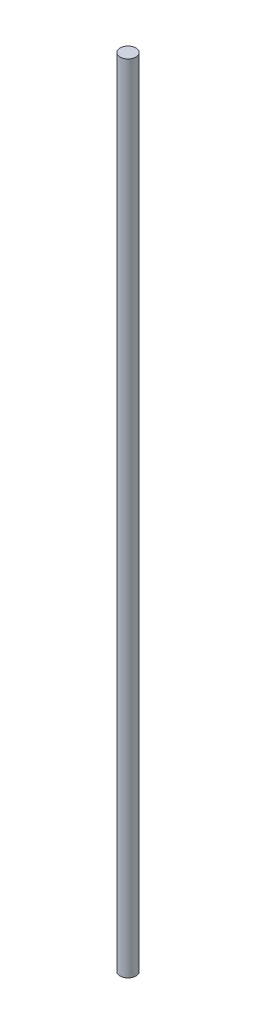
ISO-10303-21;
HEADER;
FILE_DESCRIPTION(('STEP AP214'),'2;1');
FILE_NAME('part.step','',(''),(''),'','','');
FILE_SCHEMA(('AUTOMOTIVE_DESIGN { 1 0 10303 214 1 1 1 1 }'));
ENDSEC;
DATA;
#1=APPLICATION_CONTEXT('core data for automotive mechanical design processes');
#2=APPLICATION_PROTOCOL_DEFINITION('international standard','automotive_design',2000,#1);
#3=PRODUCT_CONTEXT('',#1,'mechanical');
#4=PRODUCT('Part','Part','',(#3));
#5=PRODUCT_RELATED_PRODUCT_CATEGORY('part','',(#4));
#6=PRODUCT_DEFINITION_FORMATION('','',#4);
#7=PRODUCT_DEFINITION_CONTEXT('part definition',#1,'design');
#8=PRODUCT_DEFINITION('design','',#6,#7);
#9=PRODUCT_DEFINITION_SHAPE('','',#8);
#10=(LENGTH_UNIT() NAMED_UNIT(*) SI_UNIT(.MILLI.,.METRE.));
#11=(NAMED_UNIT(*) PLANE_ANGLE_UNIT() SI_UNIT($,.RADIAN.));
#12=(NAMED_UNIT(*) SI_UNIT($,.STERADIAN.) SOLID_ANGLE_UNIT());
#13=UNCERTAINTY_MEASURE_WITH_UNIT(LENGTH_MEASURE(1.E-05),#10,'distance_accuracy_value','');
#14=(GEOMETRIC_REPRESENTATION_CONTEXT(3) GLOBAL_UNCERTAINTY_ASSIGNED_CONTEXT((#13)) GLOBAL_UNIT_ASSIGNED_CONTEXT((#10,
#11,#12)) REPRESENTATION_CONTEXT('',''));
#15=CARTESIAN_POINT('',(0.,0.,0.));
#16=DIRECTION('',(0.,0.,1.));
#17=DIRECTION('',(1.,0.,0.));
#18=AXIS2_PLACEMENT_3D('',#15,#16,#17);
#19=CARTESIAN_POINT('',(0.,-200.,0.));
#20=DIRECTION('',(0.,1.,0.));
#21=DIRECTION('',(0.,0.,1.));
#22=AXIS2_PLACEMENT_3D('',#19,#20,#21);
#23=CYLINDRICAL_SURFACE('',#22,4.);
#24=CARTESIAN_POINT('',(0.,-200.,0.));
#25=DIRECTION('',(0.,1.,0.));
#26=DIRECTION('',(0.,0.,1.));
#27=AXIS2_PLACEMENT_3D('',#24,#25,#26);
#28=CIRCLE('',#27,4.);
#29=CARTESIAN_POINT('',(0.,-200.,4.));
#30=VERTEX_POINT('',#29);
#31=EDGE_CURVE('E10',#30,#30,#28,.T.);
#32=ORIENTED_EDGE('',*,*,#31,.T.);
#33=EDGE_LOOP('',(#32));
#34=FACE_BOUND('',#33,.T.);
#35=CARTESIAN_POINT('',(0.,200.,0.));
#36=DIRECTION('',(0.,1.,0.));
#37=DIRECTION('',(0.,0.,1.));
#38=AXIS2_PLACEMENT_3D('',#35,#36,#37);
#39=CIRCLE('',#38,4.);
#40=CARTESIAN_POINT('',(0.,200.,4.));
#41=VERTEX_POINT('',#40);
#42=EDGE_CURVE('E50',#41,#41,#39,.T.);
#43=ORIENTED_EDGE('',*,*,#42,.F.);
#44=EDGE_LOOP('',(#43));
#45=FACE_BOUND('',#44,.T.);
#46=ADVANCED_FACE('F43',(#34,#45),#23,.T.);
#47=CARTESIAN_POINT('',(0.,-200.,0.));
#48=DIRECTION('',(0.,1.,0.));
#49=DIRECTION('',(0.,0.,1.));
#50=AXIS2_PLACEMENT_3D('',#47,#48,#49);
#51=PLANE('',#50);
#52=ORIENTED_EDGE('',*,*,#31,.F.);
#53=EDGE_LOOP('',(#52));
#54=FACE_BOUND('',#53,.T.);
#55=ADVANCED_FACE('F60',(#54),#51,.F.);
#56=CARTESIAN_POINT('',(0.,200.,0.));
#57=DIRECTION('',(0.,1.,0.));
#58=DIRECTION('',(0.,0.,1.));
#59=AXIS2_PLACEMENT_3D('',#56,#57,#58);
#60=PLANE('',#59);
#61=ORIENTED_EDGE('',*,*,#42,.T.);
#62=EDGE_LOOP('',(#61));
#63=FACE_BOUND('',#62,.T.);
#64=ADVANCED_FACE('F57',(#63),#60,.T.);
#65=CLOSED_SHELL('',(#46,#55,#64));
#66=MANIFOLD_SOLID_BREP('B2',#65);
#67=ADVANCED_BREP_SHAPE_REPRESENTATION('',(#18,#66),#14);
#68=SHAPE_DEFINITION_REPRESENTATION(#9,#67);
ENDSEC;
END-ISO-10303-21;
